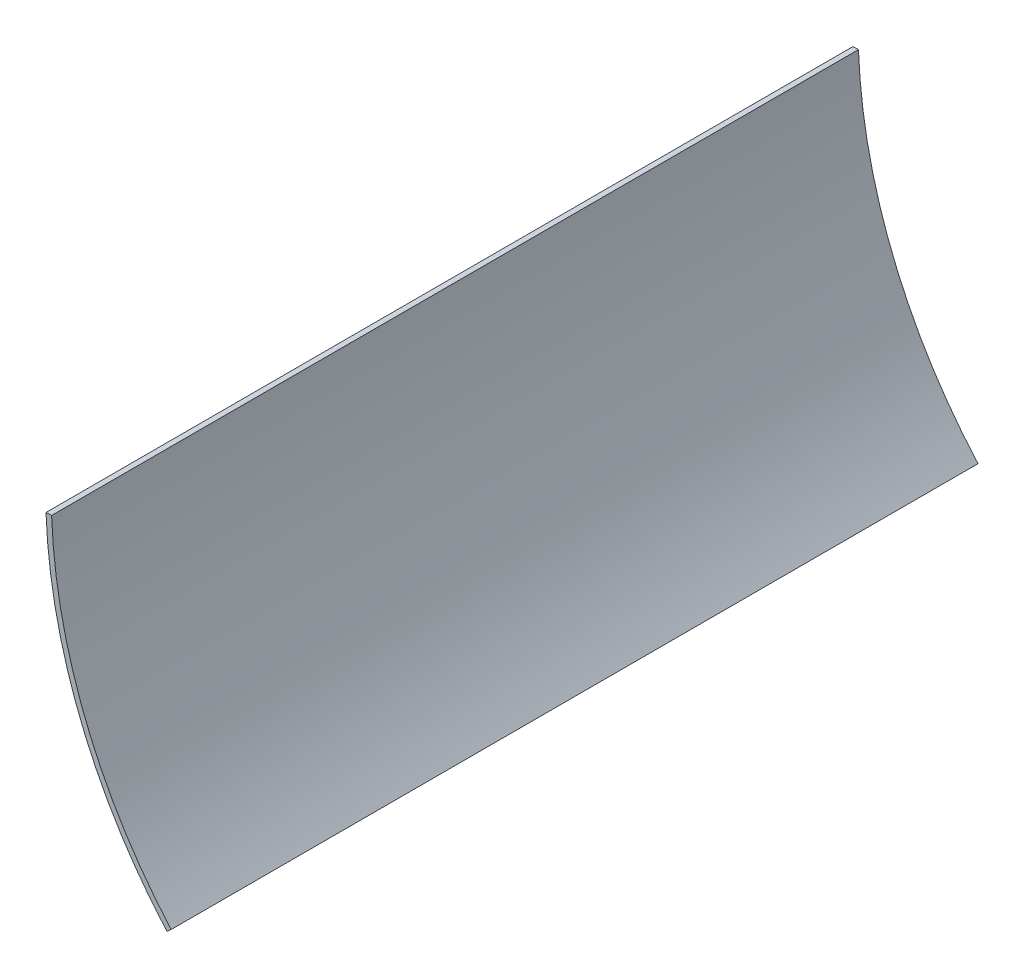
ISO-10303-21;
HEADER;
FILE_DESCRIPTION(('STEP AP214'),'2;1');
FILE_NAME('part.step','',(''),(''),'','','');
FILE_SCHEMA(('AUTOMOTIVE_DESIGN { 1 0 10303 214 1 1 1 1 }'));
ENDSEC;
DATA;
#1=APPLICATION_CONTEXT('core data for automotive mechanical design processes');
#2=APPLICATION_PROTOCOL_DEFINITION('international standard','automotive_design',2000,#1);
#3=PRODUCT_CONTEXT('',#1,'mechanical');
#4=PRODUCT('Part','Part','',(#3));
#5=PRODUCT_RELATED_PRODUCT_CATEGORY('part','',(#4));
#6=PRODUCT_DEFINITION_FORMATION('','',#4);
#7=PRODUCT_DEFINITION_CONTEXT('part definition',#1,'design');
#8=PRODUCT_DEFINITION('design','',#6,#7);
#9=PRODUCT_DEFINITION_SHAPE('','',#8);
#10=(LENGTH_UNIT() NAMED_UNIT(*) SI_UNIT(.MILLI.,.METRE.));
#11=(NAMED_UNIT(*) PLANE_ANGLE_UNIT() SI_UNIT($,.RADIAN.));
#12=(NAMED_UNIT(*) SI_UNIT($,.STERADIAN.) SOLID_ANGLE_UNIT());
#13=UNCERTAINTY_MEASURE_WITH_UNIT(LENGTH_MEASURE(1.E-05),#10,'distance_accuracy_value','');
#14=(GEOMETRIC_REPRESENTATION_CONTEXT(3) GLOBAL_UNCERTAINTY_ASSIGNED_CONTEXT((#13)) GLOBAL_UNIT_ASSIGNED_CONTEXT((#10,
#11,#12)) REPRESENTATION_CONTEXT('',''));
#15=CARTESIAN_POINT('',(0.,0.,0.));
#16=DIRECTION('',(0.,0.,1.));
#17=DIRECTION('',(1.,0.,0.));
#18=AXIS2_PLACEMENT_3D('',#15,#16,#17);
#19=CARTESIAN_POINT('',(-9.2889502385388,-85.1696561139954,-384.366530599948));
#20=DIRECTION('',(0.,0.,1.));
#21=DIRECTION('',(1.,0.,0.));
#22=AXIS2_PLACEMENT_3D('',#19,#20,#21);
#23=CYLINDRICAL_SURFACE('',#22,12.7);
#24=CARTESIAN_POINT('',(-9.2889502385388,-85.1696561139954,111.125));
#25=DIRECTION('',(0.,0.,-1.));
#26=DIRECTION('',(-1.,0.,0.));
#27=AXIS2_PLACEMENT_3D('',#24,#25,#26);
#28=CIRCLE('',#27,12.7);
#29=CARTESIAN_POINT('',(-9.2889502385388,-97.8696561139954,111.125));
#30=VERTEX_POINT('',#29);
#31=CARTESIAN_POINT('',(-9.28895023853883,-72.4696561139954,111.125));
#32=VERTEX_POINT('',#31);
#33=EDGE_CURVE('E288',#30,#32,#28,.T.);
#34=ORIENTED_EDGE('',*,*,#33,.T.);
#35=DIRECTION('',(0.,0.,1.));
#36=VECTOR('',#35,1.);
#37=CARTESIAN_POINT('',(-9.2889502385388,-72.4696561139954,-384.366530599948));
#38=LINE('',#37,#36);
#39=CARTESIAN_POINT('',(-9.2889502385388,-72.4696561139954,101.6));
#40=VERTEX_POINT('',#39);
#41=EDGE_CURVE('E248',#40,#32,#38,.T.);
#42=ORIENTED_EDGE('',*,*,#41,.F.);
#43=CARTESIAN_POINT('',(-9.2889502385388,-85.1696561139954,101.6));
#44=DIRECTION('',(0.,0.,1.));
#45=DIRECTION('',(1.,0.,0.));
#46=AXIS2_PLACEMENT_3D('',#43,#44,#45);
#47=CIRCLE('',#46,12.7);
#48=CARTESIAN_POINT('',(-9.28895023853881,-97.8696561139954,101.6));
#49=VERTEX_POINT('',#48);
#50=EDGE_CURVE('E275',#40,#49,#47,.T.);
#51=ORIENTED_EDGE('',*,*,#50,.T.);
#52=DIRECTION('',(0.,0.,1.));
#53=VECTOR('',#52,1.);
#54=CARTESIAN_POINT('',(-9.2889502385388,-97.8696561139954,-384.366530599948));
#55=LINE('',#54,#53);
#56=EDGE_CURVE('E161',#49,#30,#55,.T.);
#57=ORIENTED_EDGE('',*,*,#56,.T.);
#58=EDGE_LOOP('',(#34,#42,#51,#57));
#59=FACE_BOUND('',#58,.T.);
#60=ADVANCED_FACE('F41',(#59),#23,.T.);
#61=CARTESIAN_POINT('',(-9.2889502385388,-97.8696561139954,-139.7));
#62=VERTEX_POINT('',#61);
#63=CARTESIAN_POINT('',(-9.2889502385388,-97.8696561139954,-130.175));
#64=VERTEX_POINT('',#63);
#65=EDGE_CURVE('E185',#62,#64,#55,.T.);
#66=ORIENTED_EDGE('',*,*,#65,.T.);
#67=CARTESIAN_POINT('',(-9.2889502385388,-85.1696561139954,-130.175));
#68=DIRECTION('',(0.,0.,1.));
#69=DIRECTION('',(1.,0.,0.));
#70=AXIS2_PLACEMENT_3D('',#67,#68,#69);
#71=CIRCLE('',#70,12.7);
#72=CARTESIAN_POINT('',(-9.28895023853883,-72.4696561139954,-130.175));
#73=VERTEX_POINT('',#72);
#74=EDGE_CURVE('E63',#64,#73,#71,.F.);
#75=ORIENTED_EDGE('',*,*,#74,.T.);
#76=CARTESIAN_POINT('',(-9.2889502385388,-72.4696561139954,-139.7));
#77=VERTEX_POINT('',#76);
#78=EDGE_CURVE('E236',#77,#73,#38,.T.);
#79=ORIENTED_EDGE('',*,*,#78,.F.);
#80=CARTESIAN_POINT('',(-9.2889502385388,-85.1696561139954,-139.7));
#81=DIRECTION('',(0.,0.,1.));
#82=DIRECTION('',(1.,0.,0.));
#83=AXIS2_PLACEMENT_3D('',#80,#81,#82);
#84=CIRCLE('',#83,12.7);
#85=EDGE_CURVE('E239',#62,#77,#84,.F.);
#86=ORIENTED_EDGE('',*,*,#85,.F.);
#87=EDGE_LOOP('',(#66,#75,#79,#86));
#88=FACE_BOUND('',#87,.T.);
#89=ADVANCED_FACE('F376',(#88),#23,.T.);
#90=CARTESIAN_POINT('',(-9.2889502385388,-85.1696561139954,-111.125));
#91=DIRECTION('',(0.,0.,1.));
#92=DIRECTION('',(1.,0.,0.));
#93=AXIS2_PLACEMENT_3D('',#90,#91,#92);
#94=CIRCLE('',#93,12.7);
#95=CARTESIAN_POINT('',(-9.28895023853883,-72.4696561139954,-111.125));
#96=VERTEX_POINT('',#95);
#97=CARTESIAN_POINT('',(-9.28895023853881,-97.8696561139954,-111.125));
#98=VERTEX_POINT('',#97);
#99=EDGE_CURVE('E210',#96,#98,#94,.T.);
#100=ORIENTED_EDGE('',*,*,#99,.T.);
#101=CARTESIAN_POINT('',(-9.2889502385388,-97.8696561139954,-101.6));
#102=VERTEX_POINT('',#101);
#103=EDGE_CURVE('E164',#98,#102,#55,.T.);
#104=ORIENTED_EDGE('',*,*,#103,.T.);
#105=CARTESIAN_POINT('',(-9.2889502385388,-85.1696561139954,-101.6));
#106=DIRECTION('',(0.,0.,1.));
#107=DIRECTION('',(1.,0.,0.));
#108=AXIS2_PLACEMENT_3D('',#105,#106,#107);
#109=CIRCLE('',#108,12.7);
#110=CARTESIAN_POINT('',(-9.2889502385388,-72.4696561139954,-101.6));
#111=VERTEX_POINT('',#110);
#112=EDGE_CURVE('E208',#102,#111,#109,.F.);
#113=ORIENTED_EDGE('',*,*,#112,.T.);
#114=EDGE_CURVE('E247',#96,#111,#38,.T.);
#115=ORIENTED_EDGE('',*,*,#114,.F.);
#116=EDGE_LOOP('',(#100,#104,#113,#115));
#117=FACE_BOUND('',#116,.T.);
#118=ADVANCED_FACE('F206',(#117),#23,.T.);
#119=CARTESIAN_POINT('',(-9.2889502385388,-72.4696561139954,-384.366530599948));
#120=DIRECTION('',(0.,1.,0.));
#121=DIRECTION('',(-1.,0.,0.));
#122=AXIS2_PLACEMENT_3D('',#119,#120,#121);
#123=PLANE('',#122);
#124=ORIENTED_EDGE('',*,*,#78,.T.);
#125=DIRECTION('',(0.,0.,1.));
#126=VECTOR('',#125,1.);
#127=CARTESIAN_POINT('',(-9.28895023853883,-72.4696561139954,-175.621024484277));
#128=LINE('',#127,#126);
#129=EDGE_CURVE('E271',#73,#96,#128,.T.);
#130=ORIENTED_EDGE('',*,*,#129,.T.);
#131=ORIENTED_EDGE('',*,*,#114,.T.);
#132=DIRECTION('',(1.,0.,0.));
#133=VECTOR('',#132,1.);
#134=CARTESIAN_POINT('',(4.39536367644305,-72.4696561139953,-101.6));
#135=LINE('',#134,#133);
#136=CARTESIAN_POINT('',(4.39536367644294,-72.4696561139953,-101.6));
#137=VERTEX_POINT('',#136);
#138=EDGE_CURVE('E221',#111,#137,#135,.T.);
#139=ORIENTED_EDGE('',*,*,#138,.T.);
#140=DIRECTION('',(0.,0.,1.));
#141=VECTOR('',#140,1.);
#142=CARTESIAN_POINT('',(4.39536367644306,-72.4696561139954,-384.366530599948));
#143=LINE('',#142,#141);
#144=CARTESIAN_POINT('',(4.39536367644305,-72.4696561139953,-139.7));
#145=VERTEX_POINT('',#144);
#146=EDGE_CURVE('E249',#145,#137,#143,.T.);
#147=ORIENTED_EDGE('',*,*,#146,.F.);
#148=DIRECTION('',(1.,0.,0.));
#149=VECTOR('',#148,1.);
#150=CARTESIAN_POINT('',(-9.2889502385388,-72.4696561139954,-139.7));
#151=LINE('',#150,#149);
#152=EDGE_CURVE('E235',#77,#145,#151,.T.);
#153=ORIENTED_EDGE('',*,*,#152,.F.);
#154=EDGE_LOOP('',(#124,#130,#131,#139,#147,#153));
#155=FACE_BOUND('',#154,.T.);
#156=ADVANCED_FACE('F269',(#155),#123,.T.);
#157=CARTESIAN_POINT('',(-9.2889502385388,-97.8696561139954,-384.366530599948));
#158=DIRECTION('',(0.,-1.,0.));
#159=DIRECTION('',(1.,0.,0.));
#160=AXIS2_PLACEMENT_3D('',#157,#158,#159);
#161=PLANE('',#160);
#162=DIRECTION('',(0.,0.,1.));
#163=VECTOR('',#162,1.);
#164=CARTESIAN_POINT('',(10.7877664975289,-97.8696561139953,-384.366530599948));
#165=LINE('',#164,#163);
#166=CARTESIAN_POINT('',(10.7877664975289,-97.8696561139953,-139.7));
#167=VERTEX_POINT('',#166);
#168=CARTESIAN_POINT('',(10.7877664975289,-97.8696561139953,-101.6));
#169=VERTEX_POINT('',#168);
#170=EDGE_CURVE('E197',#167,#169,#165,.T.);
#171=ORIENTED_EDGE('',*,*,#170,.T.);
#172=DIRECTION('',(-1.,0.,0.));
#173=VECTOR('',#172,1.);
#174=CARTESIAN_POINT('',(-9.28895023853881,-97.8696561139954,-101.6));
#175=LINE('',#174,#173);
#176=EDGE_CURVE('E218',#169,#102,#175,.T.);
#177=ORIENTED_EDGE('',*,*,#176,.T.);
#178=ORIENTED_EDGE('',*,*,#103,.F.);
#179=EDGE_CURVE('E193',#64,#98,#55,.T.);
#180=ORIENTED_EDGE('',*,*,#179,.F.);
#181=ORIENTED_EDGE('',*,*,#65,.F.);
#182=DIRECTION('',(-1.,0.,0.));
#183=VECTOR('',#182,1.);
#184=CARTESIAN_POINT('',(-9.2889502385388,-97.8696561139954,-139.7));
#185=LINE('',#184,#183);
#186=EDGE_CURVE('E240',#167,#62,#185,.T.);
#187=ORIENTED_EDGE('',*,*,#186,.F.);
#188=EDGE_LOOP('',(#171,#177,#178,#180,#181,#187));
#189=FACE_BOUND('',#188,.T.);
#190=ADVANCED_FACE('F223',(#189),#161,.T.);
#191=CARTESIAN_POINT('',(406.118361376153,15.1273445504612,342.9));
#192=DIRECTION('',(0.,0.,-1.));
#193=DIRECTION('',(-1.,0.,0.));
#194=AXIS2_PLACEMENT_3D('',#191,#192,#193);
#195=CYLINDRICAL_SURFACE('',#194,411.1625);
#196=CARTESIAN_POINT('',(406.118361376153,15.1273445504612,101.6));
#197=DIRECTION('',(0.,0.,-1.));
#198=DIRECTION('',(1.,0.,0.));
#199=AXIS2_PLACEMENT_3D('',#196,#197,#198);
#200=CIRCLE('',#199,411.1625);
#201=CARTESIAN_POINT('',(10.7877664975289,-97.8696561139953,101.6));
#202=VERTEX_POINT('',#201);
#203=CARTESIAN_POINT('',(4.39536367644305,-72.4696561139953,101.6));
#204=VERTEX_POINT('',#203);
#205=EDGE_CURVE('E257',#202,#204,#200,.T.);
#206=ORIENTED_EDGE('',*,*,#205,.T.);
#207=CARTESIAN_POINT('',(4.39536367644305,-72.4696561139954,139.7));
#208=VERTEX_POINT('',#207);
#209=EDGE_CURVE('E251',#204,#208,#143,.T.);
#210=ORIENTED_EDGE('',*,*,#209,.T.);
#211=CARTESIAN_POINT('',(406.118361376153,15.1273445504612,139.7));
#212=DIRECTION('',(0.,0.,-1.));
#213=DIRECTION('',(1.,0.,0.));
#214=AXIS2_PLACEMENT_3D('',#211,#212,#213);
#215=CIRCLE('',#214,411.1625);
#216=CARTESIAN_POINT('',(10.787766497529,-97.8696561139954,139.7));
#217=VERTEX_POINT('',#216);
#218=EDGE_CURVE('E187',#217,#208,#215,.T.);
#219=ORIENTED_EDGE('',*,*,#218,.F.);
#220=EDGE_CURVE('E192',#202,#217,#165,.T.);
#221=ORIENTED_EDGE('',*,*,#220,.F.);
#222=EDGE_LOOP('',(#206,#210,#219,#221));
#223=FACE_BOUND('',#222,.T.);
#224=ORIENTED_EDGE('',*,*,#146,.T.);
#225=CARTESIAN_POINT('',(406.118361376153,15.1273445504612,-101.6));
#226=DIRECTION('',(0.,0.,1.));
#227=DIRECTION('',(1.,0.,0.));
#228=AXIS2_PLACEMENT_3D('',#225,#226,#227);
#229=CIRCLE('',#228,411.1625);
#230=EDGE_CURVE('E283',#137,#169,#229,.T.);
#231=ORIENTED_EDGE('',*,*,#230,.T.);
#232=ORIENTED_EDGE('',*,*,#170,.F.);
#233=CARTESIAN_POINT('',(406.118361376153,15.1273445504612,-139.7));
#234=DIRECTION('',(0.,0.,1.));
#235=DIRECTION('',(1.,0.,0.));
#236=AXIS2_PLACEMENT_3D('',#233,#234,#235);
#237=CIRCLE('',#236,411.1625);
#238=EDGE_CURVE('E232',#145,#167,#237,.T.);
#239=ORIENTED_EDGE('',*,*,#238,.F.);
#240=EDGE_LOOP('',(#224,#231,#232,#239));
#241=FACE_BOUND('',#240,.T.);
#242=CARTESIAN_POINT('',(406.118361376153,15.1273445504612,-342.9));
#243=DIRECTION('',(0.,0.,1.));
#244=DIRECTION('',(1.,0.,0.));
#245=AXIS2_PLACEMENT_3D('',#242,#243,#244);
#246=CIRCLE('',#245,411.1625);
#247=CARTESIAN_POINT('',(-4.7591995473768,-0.177273568950516,-342.9));
#248=VERTEX_POINT('',#247);
#249=CARTESIAN_POINT('',(98.0314254526231,-257.15383606895,-342.9));
#250=VERTEX_POINT('',#249);
#251=EDGE_CURVE('E320',#248,#250,#246,.T.);
#252=ORIENTED_EDGE('',*,*,#251,.T.);
#253=DIRECTION('',(0.,0.,-1.));
#254=VECTOR('',#253,1.);
#255=CARTESIAN_POINT('',(98.0314254526231,-257.15383606895,342.9));
#256=LINE('',#255,#254);
#257=CARTESIAN_POINT('',(98.0314254526231,-257.15383606895,342.9));
#258=VERTEX_POINT('',#257);
#259=EDGE_CURVE('E12',#258,#250,#256,.T.);
#260=ORIENTED_EDGE('',*,*,#259,.F.);
#261=CARTESIAN_POINT('',(406.118361376153,15.1273445504612,342.9));
#262=DIRECTION('',(0.,0.,1.));
#263=DIRECTION('',(1.,0.,0.));
#264=AXIS2_PLACEMENT_3D('',#261,#262,#263);
#265=CIRCLE('',#264,411.1625);
#266=CARTESIAN_POINT('',(-4.7591995473768,-0.177273568950516,342.9));
#267=VERTEX_POINT('',#266);
#268=EDGE_CURVE('E325',#267,#258,#265,.T.);
#269=ORIENTED_EDGE('',*,*,#268,.F.);
#270=DIRECTION('',(0.,0.,-1.));
#271=VECTOR('',#270,1.);
#272=CARTESIAN_POINT('',(-4.7591995473768,-0.177273568950516,342.9));
#273=LINE('',#272,#271);
#274=EDGE_CURVE('E336',#267,#248,#273,.T.);
#275=ORIENTED_EDGE('',*,*,#274,.T.);
#276=EDGE_LOOP('',(#252,#260,#269,#275));
#277=FACE_BOUND('',#276,.T.);
#278=ADVANCED_FACE('F43',(#223,#241,#277),#195,.T.);
#279=CARTESIAN_POINT('',(101.6,-254.,342.9));
#280=DIRECTION('',(0.662222796630044,-0.749306991575204,0.));
#281=DIRECTION('',(0.749306991575204,0.662222796630044,0.));
#282=AXIS2_PLACEMENT_3D('',#279,#280,#281);
#283=PLANE('',#282);
#284=DIRECTION('',(-0.749306991575204,-0.662222796630044,0.));
#285=VECTOR('',#284,1.);
#286=CARTESIAN_POINT('',(101.6,-254.,-342.9));
#287=LINE('',#286,#285);
#288=CARTESIAN_POINT('',(101.6,-254.,-342.9));
#289=VERTEX_POINT('',#288);
#290=EDGE_CURVE('E322',#289,#250,#287,.T.);
#291=ORIENTED_EDGE('',*,*,#290,.F.);
#292=DIRECTION('',(0.,0.,-1.));
#293=VECTOR('',#292,1.);
#294=CARTESIAN_POINT('',(101.6,-254.,342.9));
#295=LINE('',#294,#293);
#296=CARTESIAN_POINT('',(101.6,-254.,342.9));
#297=VERTEX_POINT('',#296);
#298=EDGE_CURVE('E49',#297,#289,#295,.T.);
#299=ORIENTED_EDGE('',*,*,#298,.F.);
#300=DIRECTION('',(-0.749306991575204,-0.662222796630044,0.));
#301=VECTOR('',#300,1.);
#302=CARTESIAN_POINT('',(101.6,-254.,342.9));
#303=LINE('',#302,#301);
#304=EDGE_CURVE('E327',#297,#258,#303,.T.);
#305=ORIENTED_EDGE('',*,*,#304,.T.);
#306=ORIENTED_EDGE('',*,*,#259,.T.);
#307=EDGE_LOOP('',(#291,#299,#305,#306));
#308=FACE_BOUND('',#307,.T.);
#309=ADVANCED_FACE('F354',(#308),#283,.T.);
#310=CARTESIAN_POINT('',(406.118361376153,15.1273445504612,342.9));
#311=DIRECTION('',(0.,0.,-1.));
#312=DIRECTION('',(-1.,0.,0.));
#313=AXIS2_PLACEMENT_3D('',#310,#311,#312);
#314=CYLINDRICAL_SURFACE('',#313,406.4);
#315=CARTESIAN_POINT('',(406.118361376153,15.1273445504612,-342.9));
#316=DIRECTION('',(0.,0.,1.));
#317=DIRECTION('',(1.,0.,0.));
#318=AXIS2_PLACEMENT_3D('',#315,#316,#317);
#319=CIRCLE('',#318,406.4);
#320=CARTESIAN_POINT('',(0.,0.,-342.9));
#321=VERTEX_POINT('',#320);
#322=EDGE_CURVE('E340',#321,#289,#319,.T.);
#323=ORIENTED_EDGE('',*,*,#322,.F.);
#324=DIRECTION('',(0.,0.,-1.));
#325=VECTOR('',#324,1.);
#326=CARTESIAN_POINT('',(0.,0.,342.9));
#327=LINE('',#326,#325);
#328=CARTESIAN_POINT('',(0.,0.,342.9));
#329=VERTEX_POINT('',#328);
#330=EDGE_CURVE('E346',#329,#321,#327,.T.);
#331=ORIENTED_EDGE('',*,*,#330,.F.);
#332=CARTESIAN_POINT('',(406.118361376153,15.1273445504612,342.9));
#333=DIRECTION('',(0.,0.,1.));
#334=DIRECTION('',(1.,0.,0.));
#335=AXIS2_PLACEMENT_3D('',#332,#333,#334);
#336=CIRCLE('',#335,406.4);
#337=EDGE_CURVE('E331',#329,#297,#336,.T.);
#338=ORIENTED_EDGE('',*,*,#337,.T.);
#339=ORIENTED_EDGE('',*,*,#298,.T.);
#340=EDGE_LOOP('',(#323,#331,#338,#339));
#341=FACE_BOUND('',#340,.T.);
#342=ADVANCED_FACE('F350',(#341),#314,.F.);
#343=CARTESIAN_POINT('',(-4.7591995473768,-0.177273568950516,342.9));
#344=DIRECTION('',(-0.0372227966300328,0.999306991575181,0.));
#345=DIRECTION('',(-0.999306991575181,-0.0372227966300328,0.));
#346=AXIS2_PLACEMENT_3D('',#343,#344,#345);
#347=PLANE('',#346);
#348=DIRECTION('',(0.999306991575181,0.0372227966300328,0.));
#349=VECTOR('',#348,1.);
#350=CARTESIAN_POINT('',(-4.7591995473768,-0.177273568950516,-342.9));
#351=LINE('',#350,#349);
#352=EDGE_CURVE('E328',#248,#321,#351,.T.);
#353=ORIENTED_EDGE('',*,*,#352,.F.);
#354=ORIENTED_EDGE('',*,*,#274,.F.);
#355=DIRECTION('',(0.999306991575181,0.0372227966300328,0.));
#356=VECTOR('',#355,1.);
#357=CARTESIAN_POINT('',(-4.7591995473768,-0.177273568950516,342.9));
#358=LINE('',#357,#356);
#359=EDGE_CURVE('E334',#267,#329,#358,.T.);
#360=ORIENTED_EDGE('',*,*,#359,.T.);
#361=ORIENTED_EDGE('',*,*,#330,.T.);
#362=EDGE_LOOP('',(#353,#354,#360,#361));
#363=FACE_BOUND('',#362,.T.);
#364=ADVANCED_FACE('F361',(#363),#347,.T.);
#365=CARTESIAN_POINT('',(406.118361376153,15.1273445504612,342.9));
#366=DIRECTION('',(0.,0.,1.));
#367=DIRECTION('',(1.,0.,0.));
#368=AXIS2_PLACEMENT_3D('',#365,#366,#367);
#369=PLANE('',#368);
#370=ORIENTED_EDGE('',*,*,#268,.T.);
#371=ORIENTED_EDGE('',*,*,#304,.F.);
#372=ORIENTED_EDGE('',*,*,#337,.F.);
#373=ORIENTED_EDGE('',*,*,#359,.F.);
#374=EDGE_LOOP('',(#370,#371,#372,#373));
#375=FACE_BOUND('',#374,.T.);
#376=ADVANCED_FACE('F365',(#375),#369,.T.);
#377=CARTESIAN_POINT('',(406.118361376153,15.1273445504612,-342.9));
#378=DIRECTION('',(0.,0.,1.));
#379=DIRECTION('',(1.,0.,0.));
#380=AXIS2_PLACEMENT_3D('',#377,#378,#379);
#381=PLANE('',#380);
#382=ORIENTED_EDGE('',*,*,#251,.F.);
#383=ORIENTED_EDGE('',*,*,#352,.T.);
#384=ORIENTED_EDGE('',*,*,#322,.T.);
#385=ORIENTED_EDGE('',*,*,#290,.T.);
#386=EDGE_LOOP('',(#382,#383,#384,#385));
#387=FACE_BOUND('',#386,.T.);
#388=ADVANCED_FACE('F358',(#387),#381,.F.);
#389=CARTESIAN_POINT('',(-9.2889502385388,-85.1696561139954,130.175));
#390=DIRECTION('',(0.,0.,1.));
#391=DIRECTION('',(1.,0.,0.));
#392=AXIS2_PLACEMENT_3D('',#389,#390,#391);
#393=CIRCLE('',#392,12.7);
#394=CARTESIAN_POINT('',(-9.28895023853881,-97.8696561139954,130.175));
#395=VERTEX_POINT('',#394);
#396=CARTESIAN_POINT('',(-9.28895023853883,-72.4696561139954,130.175));
#397=VERTEX_POINT('',#396);
#398=EDGE_CURVE('E169',#395,#397,#393,.F.);
#399=ORIENTED_EDGE('',*,*,#398,.F.);
#400=CARTESIAN_POINT('',(-9.2889502385388,-97.8696561139954,139.7));
#401=VERTEX_POINT('',#400);
#402=EDGE_CURVE('E162',#395,#401,#55,.T.);
#403=ORIENTED_EDGE('',*,*,#402,.T.);
#404=CARTESIAN_POINT('',(-9.2889502385388,-85.1696561139954,139.7));
#405=DIRECTION('',(0.,0.,1.));
#406=DIRECTION('',(1.,0.,0.));
#407=AXIS2_PLACEMENT_3D('',#404,#405,#406);
#408=CIRCLE('',#407,12.7);
#409=CARTESIAN_POINT('',(-9.2889502385388,-72.4696561139954,139.7));
#410=VERTEX_POINT('',#409);
#411=EDGE_CURVE('E225',#410,#401,#408,.T.);
#412=ORIENTED_EDGE('',*,*,#411,.F.);
#413=EDGE_CURVE('E176',#397,#410,#38,.T.);
#414=ORIENTED_EDGE('',*,*,#413,.F.);
#415=EDGE_LOOP('',(#399,#403,#412,#414));
#416=FACE_BOUND('',#415,.T.);
#417=ADVANCED_FACE('F173',(#416),#23,.T.);
#418=DIRECTION('',(-1.,0.,0.));
#419=VECTOR('',#418,1.);
#420=CARTESIAN_POINT('',(4.39536367644305,-72.4696561139953,101.6));
#421=LINE('',#420,#419);
#422=EDGE_CURVE('E230',#204,#40,#421,.T.);
#423=ORIENTED_EDGE('',*,*,#422,.T.);
#424=ORIENTED_EDGE('',*,*,#41,.T.);
#425=DIRECTION('',(0.,0.,-1.));
#426=VECTOR('',#425,1.);
#427=CARTESIAN_POINT('',(-9.28895023853883,-72.4696561139954,175.621024484277));
#428=LINE('',#427,#426);
#429=EDGE_CURVE('E266',#397,#32,#428,.T.);
#430=ORIENTED_EDGE('',*,*,#429,.F.);
#431=ORIENTED_EDGE('',*,*,#413,.T.);
#432=DIRECTION('',(-1.,0.,0.));
#433=VECTOR('',#432,1.);
#434=CARTESIAN_POINT('',(-9.2889502385388,-72.4696561139954,139.7));
#435=LINE('',#434,#433);
#436=EDGE_CURVE('E184',#208,#410,#435,.T.);
#437=ORIENTED_EDGE('',*,*,#436,.F.);
#438=ORIENTED_EDGE('',*,*,#209,.F.);
#439=EDGE_LOOP('',(#423,#424,#430,#431,#437,#438));
#440=FACE_BOUND('',#439,.T.);
#441=ADVANCED_FACE('F264',(#440),#123,.T.);
#442=DIRECTION('',(1.,0.,0.));
#443=VECTOR('',#442,1.);
#444=CARTESIAN_POINT('',(-9.28895023853881,-97.8696561139954,101.6));
#445=LINE('',#444,#443);
#446=EDGE_CURVE('E277',#49,#202,#445,.T.);
#447=ORIENTED_EDGE('',*,*,#446,.T.);
#448=ORIENTED_EDGE('',*,*,#220,.T.);
#449=DIRECTION('',(1.,0.,0.));
#450=VECTOR('',#449,1.);
#451=CARTESIAN_POINT('',(-9.2889502385388,-97.8696561139954,139.7));
#452=LINE('',#451,#450);
#453=EDGE_CURVE('E182',#401,#217,#452,.T.);
#454=ORIENTED_EDGE('',*,*,#453,.F.);
#455=ORIENTED_EDGE('',*,*,#402,.F.);
#456=EDGE_CURVE('E152',#30,#395,#55,.T.);
#457=ORIENTED_EDGE('',*,*,#456,.F.);
#458=ORIENTED_EDGE('',*,*,#56,.F.);
#459=EDGE_LOOP('',(#447,#448,#454,#455,#457,#458));
#460=FACE_BOUND('',#459,.T.);
#461=ADVANCED_FACE('F180',(#460),#161,.T.);
#462=CARTESIAN_POINT('',(-9.2889502385388,-85.1696561139954,139.7));
#463=DIRECTION('',(0.,0.,1.));
#464=DIRECTION('',(1.,0.,0.));
#465=AXIS2_PLACEMENT_3D('',#462,#463,#464);
#466=PLANE('',#465);
#467=ORIENTED_EDGE('',*,*,#411,.T.);
#468=ORIENTED_EDGE('',*,*,#453,.T.);
#469=ORIENTED_EDGE('',*,*,#218,.T.);
#470=ORIENTED_EDGE('',*,*,#436,.T.);
#471=EDGE_LOOP('',(#467,#468,#469,#470));
#472=FACE_BOUND('',#471,.T.);
#473=ADVANCED_FACE('F263',(#472),#466,.T.);
#474=CARTESIAN_POINT('',(406.118361376153,15.1273445504612,-139.7));
#475=DIRECTION('',(0.,0.,1.));
#476=DIRECTION('',(1.,0.,0.));
#477=AXIS2_PLACEMENT_3D('',#474,#475,#476);
#478=PLANE('',#477);
#479=ORIENTED_EDGE('',*,*,#85,.T.);
#480=ORIENTED_EDGE('',*,*,#152,.T.);
#481=ORIENTED_EDGE('',*,*,#238,.T.);
#482=ORIENTED_EDGE('',*,*,#186,.T.);
#483=EDGE_LOOP('',(#479,#480,#481,#482));
#484=FACE_BOUND('',#483,.T.);
#485=ADVANCED_FACE('F403',(#484),#478,.F.);
#486=CARTESIAN_POINT('',(-9.2889502385388,-85.1696561139954,101.6));
#487=DIRECTION('',(0.,0.,1.));
#488=DIRECTION('',(1.,0.,0.));
#489=AXIS2_PLACEMENT_3D('',#486,#487,#488);
#490=PLANE('',#489);
#491=ORIENTED_EDGE('',*,*,#50,.F.);
#492=ORIENTED_EDGE('',*,*,#422,.F.);
#493=ORIENTED_EDGE('',*,*,#205,.F.);
#494=ORIENTED_EDGE('',*,*,#446,.F.);
#495=EDGE_LOOP('',(#491,#492,#493,#494));
#496=FACE_BOUND('',#495,.T.);
#497=ADVANCED_FACE('F406',(#496),#490,.F.);
#498=CARTESIAN_POINT('',(406.118361376153,15.1273445504612,-101.6));
#499=DIRECTION('',(0.,0.,1.));
#500=DIRECTION('',(1.,0.,0.));
#501=AXIS2_PLACEMENT_3D('',#498,#499,#500);
#502=PLANE('',#501);
#503=ORIENTED_EDGE('',*,*,#112,.F.);
#504=ORIENTED_EDGE('',*,*,#176,.F.);
#505=ORIENTED_EDGE('',*,*,#230,.F.);
#506=ORIENTED_EDGE('',*,*,#138,.F.);
#507=EDGE_LOOP('',(#503,#504,#505,#506));
#508=FACE_BOUND('',#507,.T.);
#509=ADVANCED_FACE('F217',(#508),#502,.T.);
#510=CARTESIAN_POINT('',(-9.2889502385388,-85.1696561139954,-175.621024484277));
#511=DIRECTION('',(0.,0.,1.));
#512=DIRECTION('',(1.,0.,0.));
#513=AXIS2_PLACEMENT_3D('',#510,#511,#512);
#514=CYLINDRICAL_SURFACE('',#513,12.7);
#515=EDGE_CURVE('E279',#73,#64,#71,.F.);
#516=ORIENTED_EDGE('',*,*,#515,.T.);
#517=ORIENTED_EDGE('',*,*,#179,.T.);
#518=EDGE_CURVE('E299',#98,#96,#94,.T.);
#519=ORIENTED_EDGE('',*,*,#518,.T.);
#520=ORIENTED_EDGE('',*,*,#129,.F.);
#521=EDGE_LOOP('',(#516,#517,#519,#520));
#522=FACE_BOUND('',#521,.T.);
#523=ADVANCED_FACE('F311',(#522),#514,.F.);
#524=CARTESIAN_POINT('',(-9.2889502385388,-85.1696561139954,-175.621024484277));
#525=DIRECTION('',(0.,0.,1.));
#526=DIRECTION('',(1.,0.,0.));
#527=AXIS2_PLACEMENT_3D('',#524,#525,#526);
#528=CYLINDRICAL_SURFACE('',#527,3.048);
#529=CARTESIAN_POINT('',(-9.2889502385388,-85.1696561139954,-130.175));
#530=DIRECTION('',(0.,0.,1.));
#531=DIRECTION('',(1.,0.,0.));
#532=AXIS2_PLACEMENT_3D('',#529,#530,#531);
#533=CIRCLE('',#532,3.048);
#534=CARTESIAN_POINT('',(-6.2409502385388,-85.1696561139954,-130.175));
#535=VERTEX_POINT('',#534);
#536=EDGE_CURVE('E297',#535,#535,#533,.F.);
#537=CARTESIAN_POINT('',(-9.2889502385388,-85.1696561139954,-111.125));
#538=DIRECTION('',(0.,0.,1.));
#539=DIRECTION('',(1.,0.,0.));
#540=AXIS2_PLACEMENT_3D('',#537,#538,#539);
#541=CIRCLE('',#540,3.048);
#542=CARTESIAN_POINT('',(-6.2409502385388,-85.1696561139954,-111.125));
#543=VERTEX_POINT('',#542);
#544=EDGE_CURVE('E300',#543,#543,#541,.T.);
#545=CARTESIAN_POINT('',(-6.2409502385388,-85.1696561139954,-130.175));
#546=CARTESIAN_POINT('',(-6.2409502385388,-85.1696561139954,-129.9765625));
#547=CARTESIAN_POINT('',(-6.2409502385388,-85.1696561139954,-129.778125));
#548=CARTESIAN_POINT('',(-6.2409502385388,-85.1696561139954,-129.38125));
#549=CARTESIAN_POINT('',(-6.2409502385388,-85.1696561139954,-129.1828125));
#550=CARTESIAN_POINT('',(-6.2409502385388,-85.1696561139954,-128.7859375));
#551=CARTESIAN_POINT('',(-6.2409502385388,-85.1696561139954,-128.5875));
#552=CARTESIAN_POINT('',(-6.2409502385388,-85.1696561139954,-128.190625));
#553=CARTESIAN_POINT('',(-6.2409502385388,-85.1696561139954,-127.9921875));
#554=CARTESIAN_POINT('',(-6.2409502385388,-85.1696561139954,-127.5953125));
#555=CARTESIAN_POINT('',(-6.2409502385388,-85.1696561139954,-127.396875));
#556=CARTESIAN_POINT('',(-6.2409502385388,-85.1696561139954,-127.));
#557=CARTESIAN_POINT('',(-6.2409502385388,-85.1696561139954,-126.8015625));
#558=CARTESIAN_POINT('',(-6.2409502385388,-85.1696561139954,-126.4046875));
#559=CARTESIAN_POINT('',(-6.2409502385388,-85.1696561139954,-126.20625));
#560=CARTESIAN_POINT('',(-6.2409502385388,-85.1696561139954,-125.809375));
#561=CARTESIAN_POINT('',(-6.2409502385388,-85.1696561139954,-125.6109375));
#562=CARTESIAN_POINT('',(-6.2409502385388,-85.1696561139954,-125.2140625));
#563=CARTESIAN_POINT('',(-6.2409502385388,-85.1696561139954,-125.015625));
#564=CARTESIAN_POINT('',(-6.2409502385388,-85.1696561139954,-124.61875));
#565=CARTESIAN_POINT('',(-6.2409502385388,-85.1696561139954,-124.4203125));
#566=CARTESIAN_POINT('',(-6.2409502385388,-85.1696561139954,-124.0234375));
#567=CARTESIAN_POINT('',(-6.2409502385388,-85.1696561139954,-123.825));
#568=CARTESIAN_POINT('',(-6.2409502385388,-85.1696561139954,-123.428125));
#569=CARTESIAN_POINT('',(-6.2409502385388,-85.1696561139954,-123.2296875));
#570=CARTESIAN_POINT('',(-6.2409502385388,-85.1696561139954,-122.8328125));
#571=CARTESIAN_POINT('',(-6.2409502385388,-85.1696561139954,-122.634375));
#572=CARTESIAN_POINT('',(-6.2409502385388,-85.1696561139954,-122.2375));
#573=CARTESIAN_POINT('',(-6.2409502385388,-85.1696561139954,-122.0390625));
#574=CARTESIAN_POINT('',(-6.2409502385388,-85.1696561139954,-121.6421875));
#575=CARTESIAN_POINT('',(-6.2409502385388,-85.1696561139954,-121.44375));
#576=CARTESIAN_POINT('',(-6.2409502385388,-85.1696561139954,-121.046875));
#577=CARTESIAN_POINT('',(-6.2409502385388,-85.1696561139954,-120.8484375));
#578=CARTESIAN_POINT('',(-6.2409502385388,-85.1696561139954,-120.4515625));
#579=CARTESIAN_POINT('',(-6.2409502385388,-85.1696561139954,-120.253125));
#580=CARTESIAN_POINT('',(-6.2409502385388,-85.1696561139954,-119.85625));
#581=CARTESIAN_POINT('',(-6.2409502385388,-85.1696561139954,-119.6578125));
#582=CARTESIAN_POINT('',(-6.2409502385388,-85.1696561139954,-119.2609375));
#583=CARTESIAN_POINT('',(-6.2409502385388,-85.1696561139954,-119.0625));
#584=CARTESIAN_POINT('',(-6.2409502385388,-85.1696561139954,-118.665625));
#585=CARTESIAN_POINT('',(-6.2409502385388,-85.1696561139954,-118.4671875));
#586=CARTESIAN_POINT('',(-6.2409502385388,-85.1696561139954,-118.0703125));
#587=CARTESIAN_POINT('',(-6.2409502385388,-85.1696561139954,-117.871875));
#588=CARTESIAN_POINT('',(-6.2409502385388,-85.1696561139954,-117.475));
#589=CARTESIAN_POINT('',(-6.2409502385388,-85.1696561139954,-117.2765625));
#590=CARTESIAN_POINT('',(-6.2409502385388,-85.1696561139954,-116.8796875));
#591=CARTESIAN_POINT('',(-6.2409502385388,-85.1696561139954,-116.68125));
#592=CARTESIAN_POINT('',(-6.2409502385388,-85.1696561139954,-116.284375));
#593=CARTESIAN_POINT('',(-6.2409502385388,-85.1696561139954,-116.0859375));
#594=CARTESIAN_POINT('',(-6.2409502385388,-85.1696561139954,-115.6890625));
#595=CARTESIAN_POINT('',(-6.2409502385388,-85.1696561139954,-115.490625));
#596=CARTESIAN_POINT('',(-6.2409502385388,-85.1696561139954,-115.09375));
#597=CARTESIAN_POINT('',(-6.2409502385388,-85.1696561139954,-114.8953125));
#598=CARTESIAN_POINT('',(-6.2409502385388,-85.1696561139954,-114.4984375));
#599=CARTESIAN_POINT('',(-6.2409502385388,-85.1696561139954,-114.3));
#600=CARTESIAN_POINT('',(-6.2409502385388,-85.1696561139954,-113.903125));
#601=CARTESIAN_POINT('',(-6.2409502385388,-85.1696561139954,-113.7046875));
#602=CARTESIAN_POINT('',(-6.2409502385388,-85.1696561139954,-113.3078125));
#603=CARTESIAN_POINT('',(-6.2409502385388,-85.1696561139954,-113.109375));
#604=CARTESIAN_POINT('',(-6.2409502385388,-85.1696561139954,-112.7125));
#605=CARTESIAN_POINT('',(-6.2409502385388,-85.1696561139954,-112.5140625));
#606=CARTESIAN_POINT('',(-6.2409502385388,-85.1696561139954,-112.1171875));
#607=CARTESIAN_POINT('',(-6.2409502385388,-85.1696561139954,-111.91875));
#608=CARTESIAN_POINT('',(-6.2409502385388,-85.1696561139954,-111.521875));
#609=CARTESIAN_POINT('',(-6.2409502385388,-85.1696561139954,-111.3234375));
#610=CARTESIAN_POINT('',(-6.2409502385388,-85.1696561139954,-111.125));
#611=B_SPLINE_CURVE_WITH_KNOTS('',3,(#545,#546,#547,#548,#549,#550,#551,#552,#553,#554,#555,
#556,#557,#558,#559,#560,#561,#562,#563,#564,#565,#566,#567,#568,#569,#570,#571,#572,#573,#574,
#575,#576,#577,#578,#579,#580,#581,#582,#583,#584,#585,#586,#587,#588,#589,#590,#591,#592,#593,
#594,#595,#596,#597,#598,#599,#600,#601,#602,#603,#604,#605,#606,#607,#608,#609,#610),
.UNSPECIFIED.,.F.,.F.,(4,2,2,2,2,2,2,2,2,2,2,2,2,2,2,2,2,2,2,2,2,2,2,2,2,2,2,2,2,2,2,2,4),(0.,
0.5953125,1.190625,1.7859375,2.38125,2.97656249999997,3.57187499999997,4.16718749999997,
4.76249999999998,5.35781249999999,5.95312499999999,6.54843749999999,7.14374999999998,
7.73906249999998,8.33437499999998,8.92968749999998,9.52499999999998,10.1203125,10.715625,
11.3109375,11.90625,12.5015625,13.096875,13.6921875,14.2875,14.8828125,15.478125,16.0734375,
16.66875,17.2640625,17.859375,18.4546875,19.05),.UNSPECIFIED.);
#612=EDGE_CURVE('BSEAM307',#535,#543,#611,.T.);
#613=ORIENTED_EDGE('',*,*,#536,.F.);
#614=ORIENTED_EDGE('',*,*,#544,.F.);
#615=ORIENTED_EDGE('',*,*,#612,.T.);
#616=ORIENTED_EDGE('',*,*,#612,.F.);
#617=EDGE_LOOP('',(#613,#615,#614,#616));
#618=FACE_BOUND('',#617,.T.);
#619=ADVANCED_FACE('F307',(#618),#528,.T.);
#620=CARTESIAN_POINT('',(0.,0.,-111.125));
#621=DIRECTION('',(0.,0.,1.));
#622=DIRECTION('',(1.,0.,0.));
#623=AXIS2_PLACEMENT_3D('',#620,#621,#622);
#624=PLANE('',#623);
#625=ORIENTED_EDGE('',*,*,#544,.T.);
#626=EDGE_LOOP('',(#625));
#627=FACE_BOUND('',#626,.T.);
#628=ORIENTED_EDGE('',*,*,#99,.F.);
#629=ORIENTED_EDGE('',*,*,#518,.F.);
#630=EDGE_LOOP('',(#628,#629));
#631=FACE_BOUND('',#630,.T.);
#632=ADVANCED_FACE('F310',(#627,#631),#624,.F.);
#633=CARTESIAN_POINT('',(406.118361376153,15.1273445504612,-130.175));
#634=DIRECTION('',(0.,0.,1.));
#635=DIRECTION('',(1.,0.,0.));
#636=AXIS2_PLACEMENT_3D('',#633,#634,#635);
#637=PLANE('',#636);
#638=ORIENTED_EDGE('',*,*,#74,.F.);
#639=ORIENTED_EDGE('',*,*,#515,.F.);
#640=EDGE_LOOP('',(#638,#639));
#641=FACE_BOUND('',#640,.T.);
#642=ORIENTED_EDGE('',*,*,#536,.T.);
#643=EDGE_LOOP('',(#642));
#644=FACE_BOUND('',#643,.T.);
#645=ADVANCED_FACE('F305',(#641,#644),#637,.T.);
#646=CARTESIAN_POINT('',(-9.2889502385388,-85.1696561139954,175.621024484277));
#647=DIRECTION('',(0.,0.,-1.));
#648=DIRECTION('',(-1.,0.,0.));
#649=AXIS2_PLACEMENT_3D('',#646,#647,#648);
#650=CYLINDRICAL_SURFACE('',#649,3.048);
#651=CARTESIAN_POINT('',(-9.2889502385388,-85.1696561139954,111.125));
#652=DIRECTION('',(0.,0.,-1.));
#653=DIRECTION('',(-1.,0.,0.));
#654=AXIS2_PLACEMENT_3D('',#651,#652,#653);
#655=CIRCLE('',#654,3.048);
#656=CARTESIAN_POINT('',(-12.3369502385388,-85.1696561139954,111.125));
#657=VERTEX_POINT('',#656);
#658=EDGE_CURVE('E178',#657,#657,#655,.T.);
#659=CARTESIAN_POINT('',(-9.2889502385388,-85.1696561139954,130.175));
#660=DIRECTION('',(0.,0.,1.));
#661=DIRECTION('',(1.,0.,0.));
#662=AXIS2_PLACEMENT_3D('',#659,#660,#661);
#663=CIRCLE('',#662,3.048);
#664=CARTESIAN_POINT('',(-12.3369502385388,-85.1696561139954,130.175));
#665=VERTEX_POINT('',#664);
#666=EDGE_CURVE('E291',#665,#665,#663,.F.);
#667=CARTESIAN_POINT('',(-12.3369502385388,-85.1696561139954,111.125));
#668=CARTESIAN_POINT('',(-12.3369502385388,-85.1696561139954,111.3234375));
#669=CARTESIAN_POINT('',(-12.3369502385388,-85.1696561139954,111.521875));
#670=CARTESIAN_POINT('',(-12.3369502385388,-85.1696561139954,111.91875));
#671=CARTESIAN_POINT('',(-12.3369502385388,-85.1696561139954,112.1171875));
#672=CARTESIAN_POINT('',(-12.3369502385388,-85.1696561139954,112.5140625));
#673=CARTESIAN_POINT('',(-12.3369502385388,-85.1696561139954,112.7125));
#674=CARTESIAN_POINT('',(-12.3369502385388,-85.1696561139954,113.109375));
#675=CARTESIAN_POINT('',(-12.3369502385388,-85.1696561139954,113.3078125));
#676=CARTESIAN_POINT('',(-12.3369502385388,-85.1696561139954,113.7046875));
#677=CARTESIAN_POINT('',(-12.3369502385388,-85.1696561139954,113.903125));
#678=CARTESIAN_POINT('',(-12.3369502385388,-85.1696561139954,114.3));
#679=CARTESIAN_POINT('',(-12.3369502385388,-85.1696561139954,114.4984375));
#680=CARTESIAN_POINT('',(-12.3369502385388,-85.1696561139954,114.8953125));
#681=CARTESIAN_POINT('',(-12.3369502385388,-85.1696561139954,115.09375));
#682=CARTESIAN_POINT('',(-12.3369502385388,-85.1696561139954,115.490625));
#683=CARTESIAN_POINT('',(-12.3369502385388,-85.1696561139954,115.6890625));
#684=CARTESIAN_POINT('',(-12.3369502385388,-85.1696561139954,116.0859375));
#685=CARTESIAN_POINT('',(-12.3369502385388,-85.1696561139954,116.284375));
#686=CARTESIAN_POINT('',(-12.3369502385388,-85.1696561139954,116.68125));
#687=CARTESIAN_POINT('',(-12.3369502385388,-85.1696561139954,116.8796875));
#688=CARTESIAN_POINT('',(-12.3369502385388,-85.1696561139954,117.2765625));
#689=CARTESIAN_POINT('',(-12.3369502385388,-85.1696561139954,117.475));
#690=CARTESIAN_POINT('',(-12.3369502385388,-85.1696561139954,117.871875));
#691=CARTESIAN_POINT('',(-12.3369502385388,-85.1696561139954,118.0703125));
#692=CARTESIAN_POINT('',(-12.3369502385388,-85.1696561139954,118.4671875));
#693=CARTESIAN_POINT('',(-12.3369502385388,-85.1696561139954,118.665625));
#694=CARTESIAN_POINT('',(-12.3369502385388,-85.1696561139954,119.0625));
#695=CARTESIAN_POINT('',(-12.3369502385388,-85.1696561139954,119.2609375));
#696=CARTESIAN_POINT('',(-12.3369502385388,-85.1696561139954,119.6578125));
#697=CARTESIAN_POINT('',(-12.3369502385388,-85.1696561139954,119.85625));
#698=CARTESIAN_POINT('',(-12.3369502385388,-85.1696561139954,120.253125));
#699=CARTESIAN_POINT('',(-12.3369502385388,-85.1696561139954,120.4515625));
#700=CARTESIAN_POINT('',(-12.3369502385388,-85.1696561139954,120.8484375));
#701=CARTESIAN_POINT('',(-12.3369502385388,-85.1696561139954,121.046875));
#702=CARTESIAN_POINT('',(-12.3369502385388,-85.1696561139954,121.44375));
#703=CARTESIAN_POINT('',(-12.3369502385388,-85.1696561139954,121.6421875));
#704=CARTESIAN_POINT('',(-12.3369502385388,-85.1696561139954,122.0390625));
#705=CARTESIAN_POINT('',(-12.3369502385388,-85.1696561139954,122.2375));
#706=CARTESIAN_POINT('',(-12.3369502385388,-85.1696561139954,122.634375));
#707=CARTESIAN_POINT('',(-12.3369502385388,-85.1696561139954,122.8328125));
#708=CARTESIAN_POINT('',(-12.3369502385388,-85.1696561139954,123.2296875));
#709=CARTESIAN_POINT('',(-12.3369502385388,-85.1696561139954,123.428125));
#710=CARTESIAN_POINT('',(-12.3369502385388,-85.1696561139954,123.825));
#711=CARTESIAN_POINT('',(-12.3369502385388,-85.1696561139954,124.0234375));
#712=CARTESIAN_POINT('',(-12.3369502385388,-85.1696561139954,124.4203125));
#713=CARTESIAN_POINT('',(-12.3369502385388,-85.1696561139954,124.61875));
#714=CARTESIAN_POINT('',(-12.3369502385388,-85.1696561139954,125.015625));
#715=CARTESIAN_POINT('',(-12.3369502385388,-85.1696561139954,125.2140625));
#716=CARTESIAN_POINT('',(-12.3369502385388,-85.1696561139954,125.6109375));
#717=CARTESIAN_POINT('',(-12.3369502385388,-85.1696561139954,125.809375));
#718=CARTESIAN_POINT('',(-12.3369502385388,-85.1696561139954,126.20625));
#719=CARTESIAN_POINT('',(-12.3369502385388,-85.1696561139954,126.4046875));
#720=CARTESIAN_POINT('',(-12.3369502385388,-85.1696561139954,126.8015625));
#721=CARTESIAN_POINT('',(-12.3369502385388,-85.1696561139954,127.));
#722=CARTESIAN_POINT('',(-12.3369502385388,-85.1696561139954,127.396875));
#723=CARTESIAN_POINT('',(-12.3369502385388,-85.1696561139954,127.5953125));
#724=CARTESIAN_POINT('',(-12.3369502385388,-85.1696561139954,127.9921875));
#725=CARTESIAN_POINT('',(-12.3369502385388,-85.1696561139954,128.190625));
#726=CARTESIAN_POINT('',(-12.3369502385388,-85.1696561139954,128.5875));
#727=CARTESIAN_POINT('',(-12.3369502385388,-85.1696561139954,128.7859375));
#728=CARTESIAN_POINT('',(-12.3369502385388,-85.1696561139954,129.1828125));
#729=CARTESIAN_POINT('',(-12.3369502385388,-85.1696561139954,129.38125));
#730=CARTESIAN_POINT('',(-12.3369502385388,-85.1696561139954,129.778125));
#731=CARTESIAN_POINT('',(-12.3369502385388,-85.1696561139954,129.9765625));
#732=CARTESIAN_POINT('',(-12.3369502385388,-85.1696561139954,130.175));
#733=B_SPLINE_CURVE_WITH_KNOTS('',3,(#667,#668,#669,#670,#671,#672,#673,#674,#675,#676,#677,
#678,#679,#680,#681,#682,#683,#684,#685,#686,#687,#688,#689,#690,#691,#692,#693,#694,#695,#696,
#697,#698,#699,#700,#701,#702,#703,#704,#705,#706,#707,#708,#709,#710,#711,#712,#713,#714,#715,
#716,#717,#718,#719,#720,#721,#722,#723,#724,#725,#726,#727,#728,#729,#730,#731,#732),
.UNSPECIFIED.,.F.,.F.,(4,2,2,2,2,2,2,2,2,2,2,2,2,2,2,2,2,2,2,2,2,2,2,2,2,2,2,2,2,2,2,2,4),(0.,
0.5953125,1.190625,1.7859375,2.38124999999999,2.97656249999999,3.57187499999999,
4.16718749999999,4.76249999999999,5.35781249999999,5.95312499999999,6.54843749999998,
7.14374999999998,7.73906249999998,8.33437499999996,8.92968749999996,9.52499999999996,10.1203125,
10.715625,11.3109375,11.90625,12.5015625,13.096875,13.6921875,14.2875,14.8828125,15.478125,
16.0734375,16.66875,17.2640625,17.8593749999999,18.4546874999999,19.0499999999999),.UNSPECIFIED.);
#734=EDGE_CURVE('BSEAM414',#657,#665,#733,.T.);
#735=ORIENTED_EDGE('',*,*,#658,.F.);
#736=ORIENTED_EDGE('',*,*,#666,.T.);
#737=ORIENTED_EDGE('',*,*,#734,.T.);
#738=ORIENTED_EDGE('',*,*,#734,.F.);
#739=EDGE_LOOP('',(#735,#737,#736,#738));
#740=FACE_BOUND('',#739,.T.);
#741=ADVANCED_FACE('F414',(#740),#650,.T.);
#742=CARTESIAN_POINT('',(0.,0.,111.125));
#743=DIRECTION('',(0.,0.,-1.));
#744=DIRECTION('',(-1.,0.,0.));
#745=AXIS2_PLACEMENT_3D('',#742,#743,#744);
#746=PLANE('',#745);
#747=ORIENTED_EDGE('',*,*,#658,.T.);
#748=EDGE_LOOP('',(#747));
#749=FACE_BOUND('',#748,.T.);
#750=EDGE_CURVE('E56',#32,#30,#28,.T.);
#751=ORIENTED_EDGE('',*,*,#750,.F.);
#752=ORIENTED_EDGE('',*,*,#33,.F.);
#753=EDGE_LOOP('',(#751,#752));
#754=FACE_BOUND('',#753,.T.);
#755=ADVANCED_FACE('F418',(#749,#754),#746,.F.);
#756=CARTESIAN_POINT('',(-9.2889502385388,-85.1696561139954,175.621024484277));
#757=DIRECTION('',(0.,0.,-1.));
#758=DIRECTION('',(-1.,0.,0.));
#759=AXIS2_PLACEMENT_3D('',#756,#757,#758);
#760=CYLINDRICAL_SURFACE('',#759,12.7);
#761=ORIENTED_EDGE('',*,*,#429,.T.);
#762=ORIENTED_EDGE('',*,*,#750,.T.);
#763=ORIENTED_EDGE('',*,*,#456,.T.);
#764=EDGE_CURVE('E155',#397,#395,#393,.F.);
#765=ORIENTED_EDGE('',*,*,#764,.F.);
#766=EDGE_LOOP('',(#761,#762,#763,#765));
#767=FACE_BOUND('',#766,.T.);
#768=ADVANCED_FACE('F154',(#767),#760,.F.);
#769=CARTESIAN_POINT('',(-9.2889502385388,-85.1696561139954,130.175));
#770=DIRECTION('',(0.,0.,1.));
#771=DIRECTION('',(1.,0.,0.));
#772=AXIS2_PLACEMENT_3D('',#769,#770,#771);
#773=PLANE('',#772);
#774=ORIENTED_EDGE('',*,*,#398,.T.);
#775=ORIENTED_EDGE('',*,*,#764,.T.);
#776=EDGE_LOOP('',(#774,#775));
#777=FACE_BOUND('',#776,.T.);
#778=ORIENTED_EDGE('',*,*,#666,.F.);
#779=EDGE_LOOP('',(#778));
#780=FACE_BOUND('',#779,.T.);
#781=ADVANCED_FACE('F167',(#777,#780),#773,.F.);
#782=CLOSED_SHELL('',(#60,#89,#118,#156,#190,#278,#309,#342,#364,#376,#388,#417,#441,#461,#473,
#485,#497,#509,#523,#619,#632,#645,#741,#755,#768,#781));
#783=MANIFOLD_SOLID_BREP('B2',#782);
#784=ADVANCED_BREP_SHAPE_REPRESENTATION('',(#18,#783),#14);
#785=SHAPE_DEFINITION_REPRESENTATION(#9,#784);
ENDSEC;
END-ISO-10303-21;
